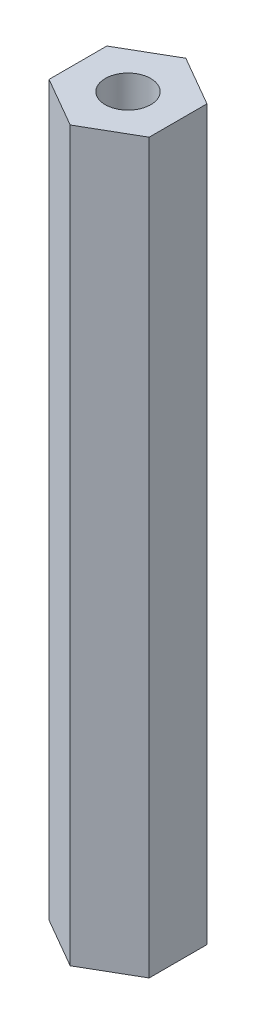
ISO-10303-21;
HEADER;
FILE_DESCRIPTION(('STEP AP214'),'2;1');
FILE_NAME('part.step','',(''),(''),'','','');
FILE_SCHEMA(('AUTOMOTIVE_DESIGN { 1 0 10303 214 1 1 1 1 }'));
ENDSEC;
DATA;
#1=APPLICATION_CONTEXT('core data for automotive mechanical design processes');
#2=APPLICATION_PROTOCOL_DEFINITION('international standard','automotive_design',2000,#1);
#3=PRODUCT_CONTEXT('',#1,'mechanical');
#4=PRODUCT('Part','Part','',(#3));
#5=PRODUCT_RELATED_PRODUCT_CATEGORY('part','',(#4));
#6=PRODUCT_DEFINITION_FORMATION('','',#4);
#7=PRODUCT_DEFINITION_CONTEXT('part definition',#1,'design');
#8=PRODUCT_DEFINITION('design','',#6,#7);
#9=PRODUCT_DEFINITION_SHAPE('','',#8);
#10=(LENGTH_UNIT() NAMED_UNIT(*) SI_UNIT(.MILLI.,.METRE.));
#11=(NAMED_UNIT(*) PLANE_ANGLE_UNIT() SI_UNIT($,.RADIAN.));
#12=(NAMED_UNIT(*) SI_UNIT($,.STERADIAN.) SOLID_ANGLE_UNIT());
#13=UNCERTAINTY_MEASURE_WITH_UNIT(LENGTH_MEASURE(1.E-05),#10,'distance_accuracy_value','');
#14=(GEOMETRIC_REPRESENTATION_CONTEXT(3) GLOBAL_UNCERTAINTY_ASSIGNED_CONTEXT((#13)) GLOBAL_UNIT_ASSIGNED_CONTEXT((#10,
#11,#12)) REPRESENTATION_CONTEXT('',''));
#15=CARTESIAN_POINT('',(0.,0.,0.));
#16=DIRECTION('',(0.,0.,1.));
#17=DIRECTION('',(1.,0.,0.));
#18=AXIS2_PLACEMENT_3D('',#15,#16,#17);
#19=CARTESIAN_POINT('',(2.75,40.,-1.58771324027147));
#20=DIRECTION('',(-0.5,0.,0.866025403784439));
#21=DIRECTION('',(0.866025403784439,0.,0.5));
#22=AXIS2_PLACEMENT_3D('',#19,#20,#21);
#23=PLANE('',#22);
#24=DIRECTION('',(-0.866025403784439,0.,-0.5));
#25=VECTOR('',#24,1.);
#26=CARTESIAN_POINT('',(2.75,0.,-1.58771324027147));
#27=LINE('',#26,#25);
#28=CARTESIAN_POINT('',(2.75,0.,-1.58771324027147));
#29=VERTEX_POINT('',#28);
#30=CARTESIAN_POINT('',(0.,0.,-3.17542648054294));
#31=VERTEX_POINT('',#30);
#32=EDGE_CURVE('E124',#29,#31,#27,.T.);
#33=ORIENTED_EDGE('',*,*,#32,.T.);
#34=DIRECTION('',(0.,-1.,0.));
#35=VECTOR('',#34,1.);
#36=CARTESIAN_POINT('',(0.,40.,-3.17542648054294));
#37=LINE('',#36,#35);
#38=CARTESIAN_POINT('',(0.,40.,-3.17542648054294));
#39=VERTEX_POINT('',#38);
#40=EDGE_CURVE('E11',#39,#31,#37,.T.);
#41=ORIENTED_EDGE('',*,*,#40,.F.);
#42=DIRECTION('',(-0.866025403784439,0.,-0.5));
#43=VECTOR('',#42,1.);
#44=CARTESIAN_POINT('',(2.75,40.,-1.58771324027147));
#45=LINE('',#44,#43);
#46=CARTESIAN_POINT('',(2.75,40.,-1.58771324027147));
#47=VERTEX_POINT('',#46);
#48=EDGE_CURVE('E134',#47,#39,#45,.T.);
#49=ORIENTED_EDGE('',*,*,#48,.F.);
#50=DIRECTION('',(0.,-1.,0.));
#51=VECTOR('',#50,1.);
#52=CARTESIAN_POINT('',(2.75,40.,-1.58771324027147));
#53=LINE('',#52,#51);
#54=EDGE_CURVE('E118',#47,#29,#53,.T.);
#55=ORIENTED_EDGE('',*,*,#54,.T.);
#56=EDGE_LOOP('',(#33,#41,#49,#55));
#57=FACE_BOUND('',#56,.T.);
#58=ADVANCED_FACE('F39',(#57),#23,.F.);
#59=CARTESIAN_POINT('',(0.,40.,-3.17542648054294));
#60=DIRECTION('',(0.5,0.,0.866025403784439));
#61=DIRECTION('',(0.866025403784439,0.,-0.5));
#62=AXIS2_PLACEMENT_3D('',#59,#60,#61);
#63=PLANE('',#62);
#64=DIRECTION('',(-0.866025403784439,0.,0.5));
#65=VECTOR('',#64,1.);
#66=CARTESIAN_POINT('',(0.,0.,-3.17542648054294));
#67=LINE('',#66,#65);
#68=CARTESIAN_POINT('',(-2.75,0.,-1.58771324027147));
#69=VERTEX_POINT('',#68);
#70=EDGE_CURVE('E127',#31,#69,#67,.T.);
#71=ORIENTED_EDGE('',*,*,#70,.T.);
#72=DIRECTION('',(0.,-1.,0.));
#73=VECTOR('',#72,1.);
#74=CARTESIAN_POINT('',(-2.75,40.,-1.58771324027147));
#75=LINE('',#74,#73);
#76=CARTESIAN_POINT('',(-2.75,40.,-1.58771324027147));
#77=VERTEX_POINT('',#76);
#78=EDGE_CURVE('E50',#77,#69,#75,.T.);
#79=ORIENTED_EDGE('',*,*,#78,.F.);
#80=DIRECTION('',(-0.866025403784439,0.,0.5));
#81=VECTOR('',#80,1.);
#82=CARTESIAN_POINT('',(0.,40.,-3.17542648054294));
#83=LINE('',#82,#81);
#84=EDGE_CURVE('E94',#39,#77,#83,.T.);
#85=ORIENTED_EDGE('',*,*,#84,.F.);
#86=ORIENTED_EDGE('',*,*,#40,.T.);
#87=EDGE_LOOP('',(#71,#79,#85,#86));
#88=FACE_BOUND('',#87,.T.);
#89=ADVANCED_FACE('F160',(#88),#63,.F.);
#90=CARTESIAN_POINT('',(-2.75,40.,-1.58771324027147));
#91=DIRECTION('',(1.,0.,0.));
#92=DIRECTION('',(0.,0.,-1.));
#93=AXIS2_PLACEMENT_3D('',#90,#91,#92);
#94=PLANE('',#93);
#95=DIRECTION('',(0.,0.,1.));
#96=VECTOR('',#95,1.);
#97=CARTESIAN_POINT('',(-2.75,0.,-1.58771324027147));
#98=LINE('',#97,#96);
#99=CARTESIAN_POINT('',(-2.75,0.,1.58771324027147));
#100=VERTEX_POINT('',#99);
#101=EDGE_CURVE('E126',#69,#100,#98,.T.);
#102=ORIENTED_EDGE('',*,*,#101,.T.);
#103=DIRECTION('',(0.,-1.,0.));
#104=VECTOR('',#103,1.);
#105=CARTESIAN_POINT('',(-2.75,40.,1.58771324027147));
#106=LINE('',#105,#104);
#107=CARTESIAN_POINT('',(-2.75,40.,1.58771324027147));
#108=VERTEX_POINT('',#107);
#109=EDGE_CURVE('E112',#108,#100,#106,.T.);
#110=ORIENTED_EDGE('',*,*,#109,.F.);
#111=DIRECTION('',(0.,0.,1.));
#112=VECTOR('',#111,1.);
#113=CARTESIAN_POINT('',(-2.75,40.,-1.58771324027147));
#114=LINE('',#113,#112);
#115=EDGE_CURVE('E102',#77,#108,#114,.T.);
#116=ORIENTED_EDGE('',*,*,#115,.F.);
#117=ORIENTED_EDGE('',*,*,#78,.T.);
#118=EDGE_LOOP('',(#102,#110,#116,#117));
#119=FACE_BOUND('',#118,.T.);
#120=ADVANCED_FACE('F140',(#119),#94,.F.);
#121=CARTESIAN_POINT('',(-2.75,40.,1.58771324027147));
#122=DIRECTION('',(0.5,0.,-0.866025403784439));
#123=DIRECTION('',(-0.866025403784439,0.,-0.5));
#124=AXIS2_PLACEMENT_3D('',#121,#122,#123);
#125=PLANE('',#124);
#126=DIRECTION('',(0.866025403784438,0.,0.5));
#127=VECTOR('',#126,1.);
#128=CARTESIAN_POINT('',(-2.75,0.,1.58771324027147));
#129=LINE('',#128,#127);
#130=CARTESIAN_POINT('',(0.,0.,3.17542648054294));
#131=VERTEX_POINT('',#130);
#132=EDGE_CURVE('E113',#100,#131,#129,.T.);
#133=ORIENTED_EDGE('',*,*,#132,.T.);
#134=DIRECTION('',(0.,-1.,0.));
#135=VECTOR('',#134,1.);
#136=CARTESIAN_POINT('',(0.,40.,3.17542648054294));
#137=LINE('',#136,#135);
#138=CARTESIAN_POINT('',(0.,40.,3.17542648054294));
#139=VERTEX_POINT('',#138);
#140=EDGE_CURVE('E109',#139,#131,#137,.T.);
#141=ORIENTED_EDGE('',*,*,#140,.F.);
#142=DIRECTION('',(0.866025403784438,0.,0.5));
#143=VECTOR('',#142,1.);
#144=CARTESIAN_POINT('',(-2.75,40.,1.58771324027147));
#145=LINE('',#144,#143);
#146=EDGE_CURVE('E100',#108,#139,#145,.T.);
#147=ORIENTED_EDGE('',*,*,#146,.F.);
#148=ORIENTED_EDGE('',*,*,#109,.T.);
#149=EDGE_LOOP('',(#133,#141,#147,#148));
#150=FACE_BOUND('',#149,.T.);
#151=ADVANCED_FACE('F111',(#150),#125,.F.);
#152=CARTESIAN_POINT('',(0.,40.,3.17542648054294));
#153=DIRECTION('',(-0.5,0.,-0.866025403784439));
#154=DIRECTION('',(-0.866025403784439,0.,0.5));
#155=AXIS2_PLACEMENT_3D('',#152,#153,#154);
#156=PLANE('',#155);
#157=DIRECTION('',(0.866025403784439,0.,-0.5));
#158=VECTOR('',#157,1.);
#159=CARTESIAN_POINT('',(0.,0.,3.17542648054294));
#160=LINE('',#159,#158);
#161=CARTESIAN_POINT('',(2.75,0.,1.58771324027147));
#162=VERTEX_POINT('',#161);
#163=EDGE_CURVE('E76',#131,#162,#160,.T.);
#164=ORIENTED_EDGE('',*,*,#163,.T.);
#165=DIRECTION('',(0.,-1.,0.));
#166=VECTOR('',#165,1.);
#167=CARTESIAN_POINT('',(2.75,40.,1.58771324027147));
#168=LINE('',#167,#166);
#169=CARTESIAN_POINT('',(2.75,40.,1.58771324027147));
#170=VERTEX_POINT('',#169);
#171=EDGE_CURVE('E114',#170,#162,#168,.T.);
#172=ORIENTED_EDGE('',*,*,#171,.F.);
#173=DIRECTION('',(0.866025403784439,0.,-0.5));
#174=VECTOR('',#173,1.);
#175=CARTESIAN_POINT('',(0.,40.,3.17542648054294));
#176=LINE('',#175,#174);
#177=EDGE_CURVE('E101',#139,#170,#176,.T.);
#178=ORIENTED_EDGE('',*,*,#177,.F.);
#179=ORIENTED_EDGE('',*,*,#140,.T.);
#180=EDGE_LOOP('',(#164,#172,#178,#179));
#181=FACE_BOUND('',#180,.T.);
#182=ADVANCED_FACE('F120',(#181),#156,.F.);
#183=CARTESIAN_POINT('',(2.75,40.,1.58771324027147));
#184=DIRECTION('',(-1.,0.,0.));
#185=DIRECTION('',(0.,0.,1.));
#186=AXIS2_PLACEMENT_3D('',#183,#184,#185);
#187=PLANE('',#186);
#188=DIRECTION('',(0.,0.,-1.));
#189=VECTOR('',#188,1.);
#190=CARTESIAN_POINT('',(2.75,0.,1.58771324027147));
#191=LINE('',#190,#189);
#192=EDGE_CURVE('E81',#162,#29,#191,.T.);
#193=ORIENTED_EDGE('',*,*,#192,.T.);
#194=ORIENTED_EDGE('',*,*,#54,.F.);
#195=DIRECTION('',(0.,0.,-1.));
#196=VECTOR('',#195,1.);
#197=CARTESIAN_POINT('',(2.75,40.,1.58771324027147));
#198=LINE('',#197,#196);
#199=EDGE_CURVE('E54',#170,#47,#198,.T.);
#200=ORIENTED_EDGE('',*,*,#199,.F.);
#201=ORIENTED_EDGE('',*,*,#171,.T.);
#202=EDGE_LOOP('',(#193,#194,#200,#201));
#203=FACE_BOUND('',#202,.T.);
#204=ADVANCED_FACE('F150',(#203),#187,.F.);
#205=CARTESIAN_POINT('',(0.,40.,0.));
#206=DIRECTION('',(0.,1.,0.));
#207=DIRECTION('',(0.,0.,1.));
#208=AXIS2_PLACEMENT_3D('',#205,#206,#207);
#209=PLANE('',#208);
#210=CARTESIAN_POINT('',(0.,40.,0.));
#211=DIRECTION('',(0.,-1.,0.));
#212=DIRECTION('',(0.,0.,-1.));
#213=AXIS2_PLACEMENT_3D('',#210,#211,#212);
#214=CIRCLE('',#213,1.24999999999999);
#215=CARTESIAN_POINT('',(0.,40.,-1.24999999999999));
#216=VERTEX_POINT('',#215);
#217=EDGE_CURVE('E130',#216,#216,#214,.T.);
#218=ORIENTED_EDGE('',*,*,#217,.T.);
#219=EDGE_LOOP('',(#218));
#220=FACE_BOUND('',#219,.T.);
#221=ORIENTED_EDGE('',*,*,#48,.T.);
#222=ORIENTED_EDGE('',*,*,#84,.T.);
#223=ORIENTED_EDGE('',*,*,#115,.T.);
#224=ORIENTED_EDGE('',*,*,#146,.T.);
#225=ORIENTED_EDGE('',*,*,#177,.T.);
#226=ORIENTED_EDGE('',*,*,#199,.T.);
#227=EDGE_LOOP('',(#221,#222,#223,#224,#225,#226));
#228=FACE_BOUND('',#227,.T.);
#229=ADVANCED_FACE('F103',(#220,#228),#209,.T.);
#230=CARTESIAN_POINT('',(0.,0.,0.));
#231=DIRECTION('',(0.,1.,0.));
#232=DIRECTION('',(0.,0.,1.));
#233=AXIS2_PLACEMENT_3D('',#230,#231,#232);
#234=PLANE('',#233);
#235=CARTESIAN_POINT('',(0.,0.,0.));
#236=DIRECTION('',(0.,-1.,0.));
#237=DIRECTION('',(0.,0.,-1.));
#238=AXIS2_PLACEMENT_3D('',#235,#236,#237);
#239=CIRCLE('',#238,1.25);
#240=CARTESIAN_POINT('',(0.,0.,-1.25));
#241=VERTEX_POINT('',#240);
#242=EDGE_CURVE('E213',#241,#241,#239,.T.);
#243=ORIENTED_EDGE('',*,*,#242,.F.);
#244=EDGE_LOOP('',(#243));
#245=FACE_BOUND('',#244,.T.);
#246=ORIENTED_EDGE('',*,*,#32,.F.);
#247=ORIENTED_EDGE('',*,*,#192,.F.);
#248=ORIENTED_EDGE('',*,*,#163,.F.);
#249=ORIENTED_EDGE('',*,*,#132,.F.);
#250=ORIENTED_EDGE('',*,*,#101,.F.);
#251=ORIENTED_EDGE('',*,*,#70,.F.);
#252=EDGE_LOOP('',(#246,#247,#248,#249,#250,#251));
#253=FACE_BOUND('',#252,.T.);
#254=ADVANCED_FACE('F141',(#245,#253),#234,.F.);
#255=CARTESIAN_POINT('',(0.,0.,0.));
#256=DIRECTION('',(0.,-1.,0.));
#257=DIRECTION('',(0.,0.,-1.));
#258=AXIS2_PLACEMENT_3D('',#255,#256,#257);
#259=CYLINDRICAL_SURFACE('',#258,1.25);
#260=ORIENTED_EDGE('',*,*,#217,.F.);
#261=EDGE_LOOP('',(#260));
#262=FACE_BOUND('',#261,.T.);
#263=ORIENTED_EDGE('',*,*,#242,.T.);
#264=EDGE_LOOP('',(#263));
#265=FACE_BOUND('',#264,.T.);
#266=ADVANCED_FACE('F198',(#262,#265),#259,.F.);
#267=CLOSED_SHELL('',(#58,#89,#120,#151,#182,#204,#229,#254,#266));
#268=MANIFOLD_SOLID_BREP('B2',#267);
#269=ADVANCED_BREP_SHAPE_REPRESENTATION('',(#18,#268),#14);
#270=SHAPE_DEFINITION_REPRESENTATION(#9,#269);
ENDSEC;
END-ISO-10303-21;
